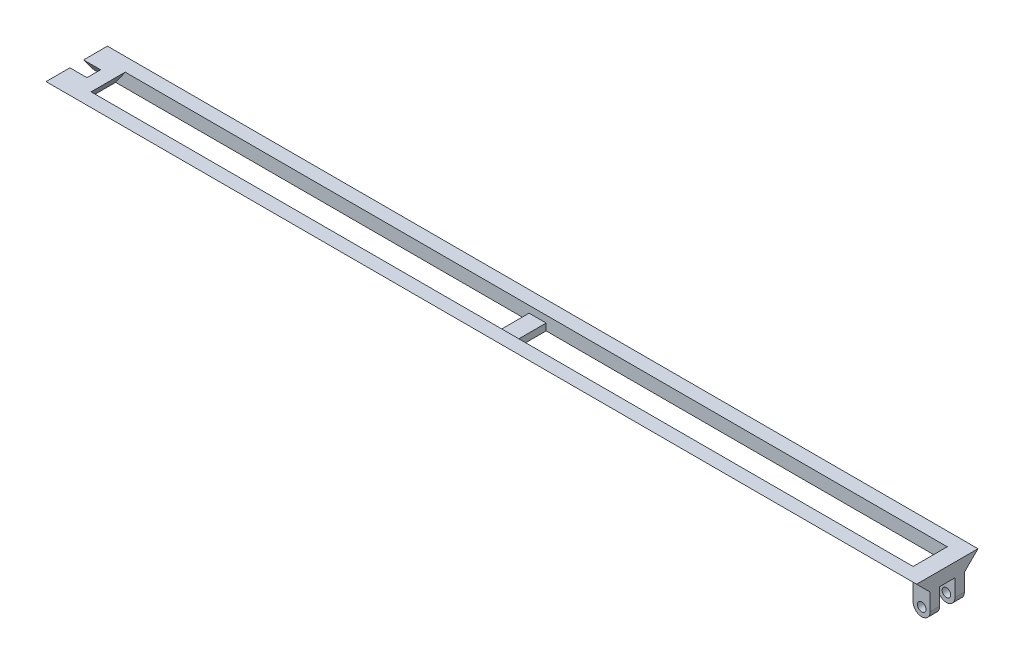
ISO-10303-21;
HEADER;
FILE_DESCRIPTION(('STEP AP214'),'2;1');
FILE_NAME('part.step','',(''),(''),'','','');
FILE_SCHEMA(('AUTOMOTIVE_DESIGN { 1 0 10303 214 1 1 1 1 }'));
ENDSEC;
DATA;
#1=APPLICATION_CONTEXT('core data for automotive mechanical design processes');
#2=APPLICATION_PROTOCOL_DEFINITION('international standard','automotive_design',2000,#1);
#3=PRODUCT_CONTEXT('',#1,'mechanical');
#4=PRODUCT('Part','Part','',(#3));
#5=PRODUCT_RELATED_PRODUCT_CATEGORY('part','',(#4));
#6=PRODUCT_DEFINITION_FORMATION('','',#4);
#7=PRODUCT_DEFINITION_CONTEXT('part definition',#1,'design');
#8=PRODUCT_DEFINITION('design','',#6,#7);
#9=PRODUCT_DEFINITION_SHAPE('','',#8);
#10=(LENGTH_UNIT() NAMED_UNIT(*) SI_UNIT(.MILLI.,.METRE.));
#11=(NAMED_UNIT(*) PLANE_ANGLE_UNIT() SI_UNIT($,.RADIAN.));
#12=(NAMED_UNIT(*) SI_UNIT($,.STERADIAN.) SOLID_ANGLE_UNIT());
#13=UNCERTAINTY_MEASURE_WITH_UNIT(LENGTH_MEASURE(1.E-05),#10,'distance_accuracy_value','');
#14=(GEOMETRIC_REPRESENTATION_CONTEXT(3) GLOBAL_UNCERTAINTY_ASSIGNED_CONTEXT((#13)) GLOBAL_UNIT_ASSIGNED_CONTEXT((#10,
#11,#12)) REPRESENTATION_CONTEXT('',''));
#15=CARTESIAN_POINT('',(0.,0.,0.));
#16=DIRECTION('',(0.,0.,1.));
#17=DIRECTION('',(1.,0.,0.));
#18=AXIS2_PLACEMENT_3D('',#15,#16,#17);
#19=CARTESIAN_POINT('',(158.75,5.08,-11.43));
#20=DIRECTION('',(-1.,0.,0.));
#21=DIRECTION('',(0.,0.,1.));
#22=AXIS2_PLACEMENT_3D('',#19,#20,#21);
#23=PLANE('',#22);
#24=DIRECTION('',(0.,1.,0.));
#25=VECTOR('',#24,1.);
#26=CARTESIAN_POINT('',(158.75,0.,-2.8575));
#27=LINE('',#26,#25);
#28=CARTESIAN_POINT('',(158.75,-6.35,-2.8575));
#29=VERTEX_POINT('',#28);
#30=CARTESIAN_POINT('',(158.75,0.,-2.8575));
#31=VERTEX_POINT('',#30);
#32=EDGE_CURVE('E200',#29,#31,#27,.T.);
#33=ORIENTED_EDGE('',*,*,#32,.F.);
#34=DIRECTION('',(0.,0.,-1.));
#35=VECTOR('',#34,1.);
#36=CARTESIAN_POINT('',(158.75,-6.35,6.35));
#37=LINE('',#36,#35);
#38=CARTESIAN_POINT('',(158.75,-6.35,-6.35));
#39=VERTEX_POINT('',#38);
#40=EDGE_CURVE('E236',#29,#39,#37,.T.);
#41=ORIENTED_EDGE('',*,*,#40,.T.);
#42=DIRECTION('',(0.,1.,0.));
#43=VECTOR('',#42,1.);
#44=CARTESIAN_POINT('',(158.75,0.,-6.35));
#45=LINE('',#44,#43);
#46=CARTESIAN_POINT('',(158.75,0.,-6.35));
#47=VERTEX_POINT('',#46);
#48=EDGE_CURVE('E231',#39,#47,#45,.T.);
#49=ORIENTED_EDGE('',*,*,#48,.T.);
#50=DIRECTION('',(0.,-0.707106781186548,0.707106781186548));
#51=VECTOR('',#50,1.);
#52=CARTESIAN_POINT('',(158.75,5.08,-11.43));
#53=LINE('',#52,#51);
#54=CARTESIAN_POINT('',(158.75,5.08,-11.43));
#55=VERTEX_POINT('',#54);
#56=EDGE_CURVE('E256',#55,#47,#53,.T.);
#57=ORIENTED_EDGE('',*,*,#56,.F.);
#58=DIRECTION('',(0.,0.,-1.));
#59=VECTOR('',#58,1.);
#60=CARTESIAN_POINT('',(158.75,5.08,-11.43));
#61=LINE('',#60,#59);
#62=CARTESIAN_POINT('',(158.75,5.08,11.43));
#63=VERTEX_POINT('',#62);
#64=EDGE_CURVE('E345',#63,#55,#61,.T.);
#65=ORIENTED_EDGE('',*,*,#64,.F.);
#66=DIRECTION('',(0.,0.707106781186548,0.707106781186548));
#67=VECTOR('',#66,1.);
#68=CARTESIAN_POINT('',(158.75,5.08,11.43));
#69=LINE('',#68,#67);
#70=CARTESIAN_POINT('',(158.75,0.,6.35));
#71=VERTEX_POINT('',#70);
#72=EDGE_CURVE('E254',#71,#63,#69,.T.);
#73=ORIENTED_EDGE('',*,*,#72,.F.);
#74=DIRECTION('',(0.,1.,0.));
#75=VECTOR('',#74,1.);
#76=CARTESIAN_POINT('',(158.75,0.,6.35));
#77=LINE('',#76,#75);
#78=CARTESIAN_POINT('',(158.75,-6.35,6.35));
#79=VERTEX_POINT('',#78);
#80=EDGE_CURVE('E233',#79,#71,#77,.T.);
#81=ORIENTED_EDGE('',*,*,#80,.F.);
#82=CARTESIAN_POINT('',(158.75,-6.35,2.8575));
#83=VERTEX_POINT('',#82);
#84=EDGE_CURVE('E243',#79,#83,#37,.T.);
#85=ORIENTED_EDGE('',*,*,#84,.T.);
#86=DIRECTION('',(0.,1.,0.));
#87=VECTOR('',#86,1.);
#88=CARTESIAN_POINT('',(158.75,0.,2.8575));
#89=LINE('',#88,#87);
#90=CARTESIAN_POINT('',(158.75,0.,2.8575));
#91=VERTEX_POINT('',#90);
#92=EDGE_CURVE('E60',#83,#91,#89,.T.);
#93=ORIENTED_EDGE('',*,*,#92,.T.);
#94=DIRECTION('',(0.,0.,1.));
#95=VECTOR('',#94,1.);
#96=CARTESIAN_POINT('',(158.75,0.,-2.8575));
#97=LINE('',#96,#95);
#98=EDGE_CURVE('E199',#31,#91,#97,.T.);
#99=ORIENTED_EDGE('',*,*,#98,.F.);
#100=EDGE_LOOP('',(#33,#41,#49,#57,#65,#73,#81,#85,#93,#99));
#101=FACE_BOUND('',#100,.T.);
#102=ADVANCED_FACE('F43',(#101),#23,.F.);
#103=CARTESIAN_POINT('',(152.4,5.08,6.35));
#104=DIRECTION('',(-1.,0.,0.));
#105=DIRECTION('',(0.,0.,1.));
#106=AXIS2_PLACEMENT_3D('',#103,#104,#105);
#107=PLANE('',#106);
#108=DIRECTION('',(0.,0.,-1.));
#109=VECTOR('',#108,1.);
#110=CARTESIAN_POINT('',(152.4,-6.35,6.35));
#111=LINE('',#110,#109);
#112=CARTESIAN_POINT('',(152.4,-6.35,-2.8575));
#113=VERTEX_POINT('',#112);
#114=CARTESIAN_POINT('',(152.4,-6.35,-6.35));
#115=VERTEX_POINT('',#114);
#116=EDGE_CURVE('E212',#113,#115,#111,.T.);
#117=ORIENTED_EDGE('',*,*,#116,.F.);
#118=DIRECTION('',(0.,-1.,0.));
#119=VECTOR('',#118,1.);
#120=CARTESIAN_POINT('',(152.4,0.,-2.8575));
#121=LINE('',#120,#119);
#122=CARTESIAN_POINT('',(152.4,0.,-2.8575));
#123=VERTEX_POINT('',#122);
#124=EDGE_CURVE('E204',#123,#113,#121,.T.);
#125=ORIENTED_EDGE('',*,*,#124,.F.);
#126=DIRECTION('',(0.,0.,1.));
#127=VECTOR('',#126,1.);
#128=CARTESIAN_POINT('',(152.4,0.,-2.8575));
#129=LINE('',#128,#127);
#130=CARTESIAN_POINT('',(152.4,0.,2.8575));
#131=VERTEX_POINT('',#130);
#132=EDGE_CURVE('E190',#123,#131,#129,.T.);
#133=ORIENTED_EDGE('',*,*,#132,.T.);
#134=DIRECTION('',(0.,-1.,0.));
#135=VECTOR('',#134,1.);
#136=CARTESIAN_POINT('',(152.4,0.,2.8575));
#137=LINE('',#136,#135);
#138=CARTESIAN_POINT('',(152.4,-6.35,2.8575));
#139=VERTEX_POINT('',#138);
#140=EDGE_CURVE('E220',#131,#139,#137,.T.);
#141=ORIENTED_EDGE('',*,*,#140,.T.);
#142=CARTESIAN_POINT('',(152.4,-6.35,6.35));
#143=VERTEX_POINT('',#142);
#144=EDGE_CURVE('E246',#143,#139,#111,.T.);
#145=ORIENTED_EDGE('',*,*,#144,.F.);
#146=DIRECTION('',(0.,-1.,0.));
#147=VECTOR('',#146,1.);
#148=CARTESIAN_POINT('',(152.4,0.,6.35));
#149=LINE('',#148,#147);
#150=CARTESIAN_POINT('',(152.4,0.,6.35));
#151=VERTEX_POINT('',#150);
#152=EDGE_CURVE('E228',#151,#143,#149,.T.);
#153=ORIENTED_EDGE('',*,*,#152,.F.);
#154=DIRECTION('',(0.,-1.,0.));
#155=VECTOR('',#154,1.);
#156=CARTESIAN_POINT('',(152.4,5.08,6.35));
#157=LINE('',#156,#155);
#158=CARTESIAN_POINT('',(152.4,5.08,6.35));
#159=VERTEX_POINT('',#158);
#160=EDGE_CURVE('E328',#159,#151,#157,.T.);
#161=ORIENTED_EDGE('',*,*,#160,.F.);
#162=DIRECTION('',(0.,0.,-1.));
#163=VECTOR('',#162,1.);
#164=CARTESIAN_POINT('',(152.4,5.08,6.35));
#165=LINE('',#164,#163);
#166=CARTESIAN_POINT('',(152.4,5.08,-6.35));
#167=VERTEX_POINT('',#166);
#168=EDGE_CURVE('E322',#159,#167,#165,.T.);
#169=ORIENTED_EDGE('',*,*,#168,.T.);
#170=DIRECTION('',(0.,-1.,0.));
#171=VECTOR('',#170,1.);
#172=CARTESIAN_POINT('',(152.4,5.08,-6.35));
#173=LINE('',#172,#171);
#174=CARTESIAN_POINT('',(152.4,0.,-6.35));
#175=VERTEX_POINT('',#174);
#176=EDGE_CURVE('E335',#167,#175,#173,.T.);
#177=ORIENTED_EDGE('',*,*,#176,.T.);
#178=DIRECTION('',(0.,-1.,0.));
#179=VECTOR('',#178,1.);
#180=CARTESIAN_POINT('',(152.4,0.,-6.35));
#181=LINE('',#180,#179);
#182=EDGE_CURVE('E226',#175,#115,#181,.T.);
#183=ORIENTED_EDGE('',*,*,#182,.T.);
#184=EDGE_LOOP('',(#117,#125,#133,#141,#145,#153,#161,#169,#177,#183));
#185=FACE_BOUND('',#184,.T.);
#186=ADVANCED_FACE('F210',(#185),#107,.T.);
#187=CARTESIAN_POINT('',(155.575,-6.35,6.35));
#188=DIRECTION('',(0.,0.,-1.));
#189=DIRECTION('',(-1.,0.,0.));
#190=AXIS2_PLACEMENT_3D('',#187,#188,#189);
#191=CYLINDRICAL_SURFACE('',#190,3.17499999999998);
#192=CARTESIAN_POINT('',(155.575,-6.35,-2.8575));
#193=DIRECTION('',(0.,0.,1.));
#194=DIRECTION('',(1.,0.,0.));
#195=AXIS2_PLACEMENT_3D('',#192,#193,#194);
#196=CIRCLE('',#195,3.17499999999998);
#197=EDGE_CURVE('E213',#113,#29,#196,.T.);
#198=ORIENTED_EDGE('',*,*,#197,.F.);
#199=ORIENTED_EDGE('',*,*,#116,.T.);
#200=CARTESIAN_POINT('',(155.575,-6.35,-6.35));
#201=DIRECTION('',(0.,0.,1.));
#202=DIRECTION('',(1.,0.,0.));
#203=AXIS2_PLACEMENT_3D('',#200,#201,#202);
#204=CIRCLE('',#203,3.17499999999998);
#205=EDGE_CURVE('E238',#115,#39,#204,.T.);
#206=ORIENTED_EDGE('',*,*,#205,.T.);
#207=ORIENTED_EDGE('',*,*,#40,.F.);
#208=EDGE_LOOP('',(#198,#199,#206,#207));
#209=FACE_BOUND('',#208,.T.);
#210=ADVANCED_FACE('F423',(#209),#191,.T.);
#211=CARTESIAN_POINT('',(0.,0.,0.));
#212=DIRECTION('',(0.,1.,0.));
#213=DIRECTION('',(0.,0.,1.));
#214=AXIS2_PLACEMENT_3D('',#211,#212,#213);
#215=PLANE('',#214);
#216=DIRECTION('',(0.,0.,-1.));
#217=VECTOR('',#216,1.);
#218=CARTESIAN_POINT('',(3.175,0.,-6.35000000000003));
#219=LINE('',#218,#217);
#220=CARTESIAN_POINT('',(3.17499999999998,0.,6.35));
#221=VERTEX_POINT('',#220);
#222=CARTESIAN_POINT('',(3.17500000000001,0.,-6.35));
#223=VERTEX_POINT('',#222);
#224=EDGE_CURVE('E278',#221,#223,#219,.T.);
#225=ORIENTED_EDGE('',*,*,#224,.F.);
#226=DIRECTION('',(1.,0.,0.));
#227=VECTOR('',#226,1.);
#228=CARTESIAN_POINT('',(-165.1,0.,6.35));
#229=LINE('',#228,#227);
#230=CARTESIAN_POINT('',(-3.17500000000004,0.,6.35));
#231=VERTEX_POINT('',#230);
#232=EDGE_CURVE('E258',#231,#221,#229,.T.);
#233=ORIENTED_EDGE('',*,*,#232,.F.);
#234=DIRECTION('',(0.,0.,1.));
#235=VECTOR('',#234,1.);
#236=CARTESIAN_POINT('',(-3.175,0.,-6.35000000000003));
#237=LINE('',#236,#235);
#238=CARTESIAN_POINT('',(-3.17500000000007,0.,-6.35));
#239=VERTEX_POINT('',#238);
#240=EDGE_CURVE('E271',#239,#231,#237,.T.);
#241=ORIENTED_EDGE('',*,*,#240,.F.);
#242=DIRECTION('',(1.,0.,0.));
#243=VECTOR('',#242,1.);
#244=CARTESIAN_POINT('',(-165.1,0.,-6.35));
#245=LINE('',#244,#243);
#246=EDGE_CURVE('E262',#239,#223,#245,.T.);
#247=ORIENTED_EDGE('',*,*,#246,.T.);
#248=EDGE_LOOP('',(#225,#233,#241,#247));
#249=FACE_BOUND('',#248,.T.);
#250=ADVANCED_FACE('F382',(#249),#215,.F.);
#251=CARTESIAN_POINT('',(-152.4,5.08,-6.35));
#252=DIRECTION('',(0.,0.,1.));
#253=DIRECTION('',(1.,0.,0.));
#254=AXIS2_PLACEMENT_3D('',#251,#252,#253);
#255=PLANE('',#254);
#256=DIRECTION('',(-1.,0.,0.));
#257=VECTOR('',#256,1.);
#258=CARTESIAN_POINT('',(3.175,2.54,-6.35000000000003));
#259=LINE('',#258,#257);
#260=CARTESIAN_POINT('',(3.175,2.54,-6.35000000000003));
#261=VERTEX_POINT('',#260);
#262=CARTESIAN_POINT('',(-3.175,2.54,-6.35000000000003));
#263=VERTEX_POINT('',#262);
#264=EDGE_CURVE('E270',#261,#263,#259,.T.);
#265=ORIENTED_EDGE('',*,*,#264,.F.);
#266=DIRECTION('',(0.,-1.,0.));
#267=VECTOR('',#266,1.);
#268=CARTESIAN_POINT('',(3.175,2.54,-6.35000000000003));
#269=LINE('',#268,#267);
#270=EDGE_CURVE('E291',#261,#223,#269,.T.);
#271=ORIENTED_EDGE('',*,*,#270,.T.);
#272=DIRECTION('',(-1.,0.,0.));
#273=VECTOR('',#272,1.);
#274=CARTESIAN_POINT('',(-152.4,0.,-6.35));
#275=LINE('',#274,#273);
#276=EDGE_CURVE('E329',#175,#223,#275,.T.);
#277=ORIENTED_EDGE('',*,*,#276,.F.);
#278=ORIENTED_EDGE('',*,*,#176,.F.);
#279=DIRECTION('',(-1.,0.,0.));
#280=VECTOR('',#279,1.);
#281=CARTESIAN_POINT('',(-152.4,5.08,-6.35));
#282=LINE('',#281,#280);
#283=CARTESIAN_POINT('',(-153.414418528865,5.08,-6.35));
#284=VERTEX_POINT('',#283);
#285=EDGE_CURVE('E67',#167,#284,#282,.T.);
#286=ORIENTED_EDGE('',*,*,#285,.T.);
#287=DIRECTION('',(-0.57357643635105,-0.819152044288989,0.));
#288=VECTOR('',#287,1.);
#289=CARTESIAN_POINT('',(-156.97147282297,0.,-6.35));
#290=LINE('',#289,#288);
#291=CARTESIAN_POINT('',(-156.97147282297,0.,-6.35));
#292=VERTEX_POINT('',#291);
#293=EDGE_CURVE('E11',#284,#292,#290,.T.);
#294=ORIENTED_EDGE('',*,*,#293,.T.);
#295=EDGE_CURVE('E314',#239,#292,#275,.T.);
#296=ORIENTED_EDGE('',*,*,#295,.F.);
#297=DIRECTION('',(0.,-1.,0.));
#298=VECTOR('',#297,1.);
#299=CARTESIAN_POINT('',(-3.175,2.54,-6.35000000000003));
#300=LINE('',#299,#298);
#301=EDGE_CURVE('E288',#263,#239,#300,.T.);
#302=ORIENTED_EDGE('',*,*,#301,.F.);
#303=EDGE_LOOP('',(#265,#271,#277,#278,#286,#294,#296,#302));
#304=FACE_BOUND('',#303,.T.);
#305=ADVANCED_FACE('F374',(#304),#255,.T.);
#306=CARTESIAN_POINT('',(-152.4,5.08,6.35));
#307=DIRECTION('',(0.,0.,-1.));
#308=DIRECTION('',(-1.,0.,0.));
#309=AXIS2_PLACEMENT_3D('',#306,#307,#308);
#310=PLANE('',#309);
#311=DIRECTION('',(1.,0.,0.));
#312=VECTOR('',#311,1.);
#313=CARTESIAN_POINT('',(-152.4,0.,6.35));
#314=LINE('',#313,#312);
#315=EDGE_CURVE('E331',#221,#151,#314,.T.);
#316=ORIENTED_EDGE('',*,*,#315,.F.);
#317=DIRECTION('',(0.,-1.,0.));
#318=VECTOR('',#317,1.);
#319=CARTESIAN_POINT('',(3.17500000000002,2.54,6.35));
#320=LINE('',#319,#318);
#321=CARTESIAN_POINT('',(3.17500000000002,2.54,6.35));
#322=VERTEX_POINT('',#321);
#323=EDGE_CURVE('E277',#322,#221,#320,.T.);
#324=ORIENTED_EDGE('',*,*,#323,.F.);
#325=DIRECTION('',(1.,0.,0.));
#326=VECTOR('',#325,1.);
#327=CARTESIAN_POINT('',(3.17500000000002,2.54,6.35));
#328=LINE('',#327,#326);
#329=CARTESIAN_POINT('',(-3.17500000000001,2.54,6.35));
#330=VERTEX_POINT('',#329);
#331=EDGE_CURVE('E275',#330,#322,#328,.T.);
#332=ORIENTED_EDGE('',*,*,#331,.F.);
#333=DIRECTION('',(0.,-1.,0.));
#334=VECTOR('',#333,1.);
#335=CARTESIAN_POINT('',(-3.17500000000001,2.54,6.35));
#336=LINE('',#335,#334);
#337=EDGE_CURVE('E285',#330,#231,#336,.T.);
#338=ORIENTED_EDGE('',*,*,#337,.T.);
#339=CARTESIAN_POINT('',(-156.97147282297,0.,6.35));
#340=VERTEX_POINT('',#339);
#341=EDGE_CURVE('E324',#340,#231,#314,.T.);
#342=ORIENTED_EDGE('',*,*,#341,.F.);
#343=DIRECTION('',(0.57357643635105,0.819152044288989,0.));
#344=VECTOR('',#343,1.);
#345=CARTESIAN_POINT('',(-156.97147282297,0.,6.35));
#346=LINE('',#345,#344);
#347=CARTESIAN_POINT('',(-153.414418528865,5.08,6.35));
#348=VERTEX_POINT('',#347);
#349=EDGE_CURVE('E53',#340,#348,#346,.T.);
#350=ORIENTED_EDGE('',*,*,#349,.T.);
#351=DIRECTION('',(1.,0.,0.));
#352=VECTOR('',#351,1.);
#353=CARTESIAN_POINT('',(-152.4,5.08,6.35));
#354=LINE('',#353,#352);
#355=EDGE_CURVE('E326',#348,#159,#354,.T.);
#356=ORIENTED_EDGE('',*,*,#355,.T.);
#357=ORIENTED_EDGE('',*,*,#160,.T.);
#358=EDGE_LOOP('',(#316,#324,#332,#338,#342,#350,#356,#357));
#359=FACE_BOUND('',#358,.T.);
#360=ADVANCED_FACE('F361',(#359),#310,.T.);
#361=CARTESIAN_POINT('',(-165.1,5.08,-11.43));
#362=DIRECTION('',(1.,0.,0.));
#363=DIRECTION('',(0.,0.,-1.));
#364=AXIS2_PLACEMENT_3D('',#361,#362,#363);
#365=PLANE('',#364);
#366=DIRECTION('',(0.,0.,1.));
#367=VECTOR('',#366,1.);
#368=CARTESIAN_POINT('',(-165.1,5.08,-11.43));
#369=LINE('',#368,#367);
#370=CARTESIAN_POINT('',(-165.1,5.08,-11.43));
#371=VERTEX_POINT('',#370);
#372=CARTESIAN_POINT('',(-165.1,5.08,-2.54));
#373=VERTEX_POINT('',#372);
#374=EDGE_CURVE('E339',#371,#373,#369,.T.);
#375=ORIENTED_EDGE('',*,*,#374,.F.);
#376=DIRECTION('',(0.,-0.707106781186548,0.707106781186548));
#377=VECTOR('',#376,1.);
#378=CARTESIAN_POINT('',(-165.1,5.08,-11.43));
#379=LINE('',#378,#377);
#380=CARTESIAN_POINT('',(-165.1,0.,-6.35));
#381=VERTEX_POINT('',#380);
#382=EDGE_CURVE('E265',#371,#381,#379,.T.);
#383=ORIENTED_EDGE('',*,*,#382,.T.);
#384=DIRECTION('',(0.,-0.8,-0.6));
#385=VECTOR('',#384,1.);
#386=CARTESIAN_POINT('',(-165.1,5.08,-2.54));
#387=LINE('',#386,#385);
#388=EDGE_CURVE('E294',#373,#381,#387,.T.);
#389=ORIENTED_EDGE('',*,*,#388,.F.);
#390=EDGE_LOOP('',(#375,#383,#389));
#391=FACE_BOUND('',#390,.T.);
#392=ADVANCED_FACE('F413',(#391),#365,.F.);
#393=CARTESIAN_POINT('',(0.,5.08,0.));
#394=DIRECTION('',(0.,1.,0.));
#395=DIRECTION('',(0.,0.,1.));
#396=AXIS2_PLACEMENT_3D('',#393,#394,#395);
#397=PLANE('',#396);
#398=ORIENTED_EDGE('',*,*,#355,.F.);
#399=DIRECTION('',(0.,0.,-1.));
#400=VECTOR('',#399,1.);
#401=CARTESIAN_POINT('',(-153.414418528865,5.08,0.));
#402=LINE('',#401,#400);
#403=EDGE_CURVE('E354',#348,#284,#402,.T.);
#404=ORIENTED_EDGE('',*,*,#403,.T.);
#405=ORIENTED_EDGE('',*,*,#285,.F.);
#406=ORIENTED_EDGE('',*,*,#168,.F.);
#407=EDGE_LOOP('',(#398,#404,#405,#406));
#408=FACE_BOUND('',#407,.T.);
#409=DIRECTION('',(-1.,0.,0.));
#410=VECTOR('',#409,1.);
#411=CARTESIAN_POINT('',(-158.75,5.08,-2.54));
#412=LINE('',#411,#410);
#413=CARTESIAN_POINT('',(-158.75,5.08,-2.54));
#414=VERTEX_POINT('',#413);
#415=EDGE_CURVE('E312',#414,#373,#412,.T.);
#416=ORIENTED_EDGE('',*,*,#415,.F.);
#417=DIRECTION('',(0.,0.,-1.));
#418=VECTOR('',#417,1.);
#419=CARTESIAN_POINT('',(-158.75,5.08,-2.54));
#420=LINE('',#419,#418);
#421=CARTESIAN_POINT('',(-158.75,5.08,2.54));
#422=VERTEX_POINT('',#421);
#423=EDGE_CURVE('E305',#422,#414,#420,.T.);
#424=ORIENTED_EDGE('',*,*,#423,.F.);
#425=DIRECTION('',(-1.,0.,0.));
#426=VECTOR('',#425,1.);
#427=CARTESIAN_POINT('',(-158.75,5.08,2.54));
#428=LINE('',#427,#426);
#429=CARTESIAN_POINT('',(-165.1,5.08,2.54));
#430=VERTEX_POINT('',#429);
#431=EDGE_CURVE('E315',#422,#430,#428,.T.);
#432=ORIENTED_EDGE('',*,*,#431,.T.);
#433=CARTESIAN_POINT('',(-165.1,5.08,11.43));
#434=VERTEX_POINT('',#433);
#435=EDGE_CURVE('E338',#430,#434,#369,.T.);
#436=ORIENTED_EDGE('',*,*,#435,.T.);
#437=DIRECTION('',(1.,0.,0.));
#438=VECTOR('',#437,1.);
#439=CARTESIAN_POINT('',(-165.1,5.08,11.43));
#440=LINE('',#439,#438);
#441=EDGE_CURVE('E342',#434,#63,#440,.T.);
#442=ORIENTED_EDGE('',*,*,#441,.T.);
#443=ORIENTED_EDGE('',*,*,#64,.T.);
#444=DIRECTION('',(-1.,0.,0.));
#445=VECTOR('',#444,1.);
#446=CARTESIAN_POINT('',(-165.1,5.08,-11.43));
#447=LINE('',#446,#445);
#448=EDGE_CURVE('E348',#55,#371,#447,.T.);
#449=ORIENTED_EDGE('',*,*,#448,.T.);
#450=ORIENTED_EDGE('',*,*,#374,.T.);
#451=EDGE_LOOP('',(#416,#424,#432,#436,#442,#443,#449,#450));
#452=FACE_BOUND('',#451,.T.);
#453=ADVANCED_FACE('F367',(#408,#452),#397,.T.);
#454=CARTESIAN_POINT('',(-158.75,0.,-6.35));
#455=VERTEX_POINT('',#454);
#456=EDGE_CURVE('E263',#455,#292,#245,.T.);
#457=ORIENTED_EDGE('',*,*,#456,.T.);
#458=DIRECTION('',(0.,0.,1.));
#459=VECTOR('',#458,1.);
#460=CARTESIAN_POINT('',(-156.97147282297,0.,6.35));
#461=LINE('',#460,#459);
#462=EDGE_CURVE('E351',#292,#340,#461,.T.);
#463=ORIENTED_EDGE('',*,*,#462,.T.);
#464=CARTESIAN_POINT('',(-158.75,0.,6.35));
#465=VERTEX_POINT('',#464);
#466=EDGE_CURVE('E259',#465,#340,#229,.T.);
#467=ORIENTED_EDGE('',*,*,#466,.F.);
#468=DIRECTION('',(0.,0.,1.));
#469=VECTOR('',#468,1.);
#470=CARTESIAN_POINT('',(-158.75,0.,-6.35));
#471=LINE('',#470,#469);
#472=EDGE_CURVE('E298',#455,#465,#471,.T.);
#473=ORIENTED_EDGE('',*,*,#472,.F.);
#474=EDGE_LOOP('',(#457,#463,#467,#473));
#475=FACE_BOUND('',#474,.T.);
#476=ADVANCED_FACE('F399',(#475),#215,.F.);
#477=DIRECTION('',(0.,0.8,-0.6));
#478=VECTOR('',#477,1.);
#479=CARTESIAN_POINT('',(-165.1,0.,6.35));
#480=LINE('',#479,#478);
#481=CARTESIAN_POINT('',(-165.1,0.,6.35));
#482=VERTEX_POINT('',#481);
#483=EDGE_CURVE('E299',#482,#430,#480,.T.);
#484=ORIENTED_EDGE('',*,*,#483,.F.);
#485=DIRECTION('',(0.,0.707106781186548,0.707106781186548));
#486=VECTOR('',#485,1.);
#487=CARTESIAN_POINT('',(-165.1,5.08,11.43));
#488=LINE('',#487,#486);
#489=EDGE_CURVE('E250',#482,#434,#488,.T.);
#490=ORIENTED_EDGE('',*,*,#489,.T.);
#491=ORIENTED_EDGE('',*,*,#435,.F.);
#492=EDGE_LOOP('',(#484,#490,#491));
#493=FACE_BOUND('',#492,.T.);
#494=ADVANCED_FACE('F436',(#493),#365,.F.);
#495=CARTESIAN_POINT('',(-158.75,5.08,-2.54));
#496=DIRECTION('',(0.,0.6,-0.8));
#497=DIRECTION('',(0.,0.8,0.6));
#498=AXIS2_PLACEMENT_3D('',#495,#496,#497);
#499=PLANE('',#498);
#500=ORIENTED_EDGE('',*,*,#388,.T.);
#501=DIRECTION('',(-1.,0.,0.));
#502=VECTOR('',#501,1.);
#503=CARTESIAN_POINT('',(-158.75,0.,-6.35));
#504=LINE('',#503,#502);
#505=EDGE_CURVE('E308',#455,#381,#504,.T.);
#506=ORIENTED_EDGE('',*,*,#505,.F.);
#507=DIRECTION('',(0.,-0.8,-0.6));
#508=VECTOR('',#507,1.);
#509=CARTESIAN_POINT('',(-158.75,5.08,-2.54));
#510=LINE('',#509,#508);
#511=EDGE_CURVE('E295',#414,#455,#510,.T.);
#512=ORIENTED_EDGE('',*,*,#511,.F.);
#513=ORIENTED_EDGE('',*,*,#415,.T.);
#514=EDGE_LOOP('',(#500,#506,#512,#513));
#515=FACE_BOUND('',#514,.T.);
#516=ADVANCED_FACE('F409',(#515),#499,.F.);
#517=CARTESIAN_POINT('',(-158.75,0.,6.35));
#518=DIRECTION('',(0.,0.6,0.8));
#519=DIRECTION('',(0.,-0.8,0.6));
#520=AXIS2_PLACEMENT_3D('',#517,#518,#519);
#521=PLANE('',#520);
#522=ORIENTED_EDGE('',*,*,#483,.T.);
#523=ORIENTED_EDGE('',*,*,#431,.F.);
#524=DIRECTION('',(0.,0.8,-0.6));
#525=VECTOR('',#524,1.);
#526=CARTESIAN_POINT('',(-158.75,0.,6.35));
#527=LINE('',#526,#525);
#528=EDGE_CURVE('E302',#465,#422,#527,.T.);
#529=ORIENTED_EDGE('',*,*,#528,.F.);
#530=DIRECTION('',(-1.,0.,0.));
#531=VECTOR('',#530,1.);
#532=CARTESIAN_POINT('',(-158.75,0.,6.35));
#533=LINE('',#532,#531);
#534=EDGE_CURVE('E318',#465,#482,#533,.T.);
#535=ORIENTED_EDGE('',*,*,#534,.T.);
#536=EDGE_LOOP('',(#522,#523,#529,#535));
#537=FACE_BOUND('',#536,.T.);
#538=ADVANCED_FACE('F401',(#537),#521,.F.);
#539=CARTESIAN_POINT('',(-158.75,0.,0.));
#540=DIRECTION('',(1.,0.,0.));
#541=DIRECTION('',(0.,0.,-1.));
#542=AXIS2_PLACEMENT_3D('',#539,#540,#541);
#543=PLANE('',#542);
#544=ORIENTED_EDGE('',*,*,#511,.T.);
#545=ORIENTED_EDGE('',*,*,#472,.T.);
#546=ORIENTED_EDGE('',*,*,#528,.T.);
#547=ORIENTED_EDGE('',*,*,#423,.T.);
#548=EDGE_LOOP('',(#544,#545,#546,#547));
#549=FACE_BOUND('',#548,.T.);
#550=ADVANCED_FACE('F405',(#549),#543,.F.);
#551=CARTESIAN_POINT('',(3.175,2.54,-6.35000000000003));
#552=DIRECTION('',(-1.,0.,0.));
#553=DIRECTION('',(0.,0.,1.));
#554=AXIS2_PLACEMENT_3D('',#551,#552,#553);
#555=PLANE('',#554);
#556=ORIENTED_EDGE('',*,*,#224,.T.);
#557=ORIENTED_EDGE('',*,*,#270,.F.);
#558=DIRECTION('',(0.,0.,-1.));
#559=VECTOR('',#558,1.);
#560=CARTESIAN_POINT('',(3.175,2.54,-6.35000000000003));
#561=LINE('',#560,#559);
#562=EDGE_CURVE('E268',#322,#261,#561,.T.);
#563=ORIENTED_EDGE('',*,*,#562,.F.);
#564=ORIENTED_EDGE('',*,*,#323,.T.);
#565=EDGE_LOOP('',(#556,#557,#563,#564));
#566=FACE_BOUND('',#565,.T.);
#567=ADVANCED_FACE('F385',(#566),#555,.F.);
#568=CARTESIAN_POINT('',(-3.175,2.54,-6.35000000000003));
#569=DIRECTION('',(1.,0.,0.));
#570=DIRECTION('',(0.,0.,-1.));
#571=AXIS2_PLACEMENT_3D('',#568,#569,#570);
#572=PLANE('',#571);
#573=ORIENTED_EDGE('',*,*,#240,.T.);
#574=ORIENTED_EDGE('',*,*,#337,.F.);
#575=DIRECTION('',(0.,0.,1.));
#576=VECTOR('',#575,1.);
#577=CARTESIAN_POINT('',(-3.175,2.54,-6.35000000000003));
#578=LINE('',#577,#576);
#579=EDGE_CURVE('E273',#263,#330,#578,.T.);
#580=ORIENTED_EDGE('',*,*,#579,.F.);
#581=ORIENTED_EDGE('',*,*,#301,.T.);
#582=EDGE_LOOP('',(#573,#574,#580,#581));
#583=FACE_BOUND('',#582,.T.);
#584=ADVANCED_FACE('F465',(#583),#572,.F.);
#585=CARTESIAN_POINT('',(0.,2.54,0.));
#586=DIRECTION('',(0.,-1.,0.));
#587=DIRECTION('',(0.,0.,-1.));
#588=AXIS2_PLACEMENT_3D('',#585,#586,#587);
#589=PLANE('',#588);
#590=ORIENTED_EDGE('',*,*,#562,.T.);
#591=ORIENTED_EDGE('',*,*,#264,.T.);
#592=ORIENTED_EDGE('',*,*,#579,.T.);
#593=ORIENTED_EDGE('',*,*,#331,.T.);
#594=EDGE_LOOP('',(#590,#591,#592,#593));
#595=FACE_BOUND('',#594,.T.);
#596=ADVANCED_FACE('F468',(#595),#589,.F.);
#597=CARTESIAN_POINT('',(-165.1,5.08,11.43));
#598=DIRECTION('',(0.,0.707106781186547,-0.707106781186547));
#599=DIRECTION('',(0.,0.707106781186548,0.707106781186548));
#600=AXIS2_PLACEMENT_3D('',#597,#598,#599);
#601=PLANE('',#600);
#602=ORIENTED_EDGE('',*,*,#72,.T.);
#603=ORIENTED_EDGE('',*,*,#441,.F.);
#604=ORIENTED_EDGE('',*,*,#489,.F.);
#605=ORIENTED_EDGE('',*,*,#534,.F.);
#606=ORIENTED_EDGE('',*,*,#466,.T.);
#607=ORIENTED_EDGE('',*,*,#341,.T.);
#608=ORIENTED_EDGE('',*,*,#232,.T.);
#609=ORIENTED_EDGE('',*,*,#315,.T.);
#610=EDGE_CURVE('E253',#151,#71,#229,.T.);
#611=ORIENTED_EDGE('',*,*,#610,.T.);
#612=EDGE_LOOP('',(#602,#603,#604,#605,#606,#607,#608,#609,#611));
#613=FACE_BOUND('',#612,.T.);
#614=ADVANCED_FACE('F390',(#613),#601,.F.);
#615=CARTESIAN_POINT('',(-165.1,5.08,-11.43));
#616=DIRECTION('',(0.,0.707106781186547,0.707106781186547));
#617=DIRECTION('',(0.,-0.707106781186548,0.707106781186548));
#618=AXIS2_PLACEMENT_3D('',#615,#616,#617);
#619=PLANE('',#618);
#620=ORIENTED_EDGE('',*,*,#56,.T.);
#621=EDGE_CURVE('E249',#175,#47,#245,.T.);
#622=ORIENTED_EDGE('',*,*,#621,.F.);
#623=ORIENTED_EDGE('',*,*,#276,.T.);
#624=ORIENTED_EDGE('',*,*,#246,.F.);
#625=ORIENTED_EDGE('',*,*,#295,.T.);
#626=ORIENTED_EDGE('',*,*,#456,.F.);
#627=ORIENTED_EDGE('',*,*,#505,.T.);
#628=ORIENTED_EDGE('',*,*,#382,.F.);
#629=ORIENTED_EDGE('',*,*,#448,.F.);
#630=EDGE_LOOP('',(#620,#622,#623,#624,#625,#626,#627,#628,#629));
#631=FACE_BOUND('',#630,.T.);
#632=ADVANCED_FACE('F378',(#631),#619,.F.);
#633=CARTESIAN_POINT('',(-156.97147282297,0.,0.));
#634=DIRECTION('',(0.819152044288989,-0.57357643635105,0.));
#635=DIRECTION('',(0.,0.,-1.));
#636=AXIS2_PLACEMENT_3D('',#633,#634,#635);
#637=PLANE('',#636);
#638=ORIENTED_EDGE('',*,*,#293,.F.);
#639=ORIENTED_EDGE('',*,*,#403,.F.);
#640=ORIENTED_EDGE('',*,*,#349,.F.);
#641=ORIENTED_EDGE('',*,*,#462,.F.);
#642=EDGE_LOOP('',(#638,#639,#640,#641));
#643=FACE_BOUND('',#642,.T.);
#644=ADVANCED_FACE('F46',(#643),#637,.T.);
#645=ORIENTED_EDGE('',*,*,#144,.T.);
#646=CARTESIAN_POINT('',(155.575,-6.35,2.8575));
#647=DIRECTION('',(0.,0.,1.));
#648=DIRECTION('',(1.,0.,0.));
#649=AXIS2_PLACEMENT_3D('',#646,#647,#648);
#650=CIRCLE('',#649,3.17499999999998);
#651=EDGE_CURVE('E223',#139,#83,#650,.T.);
#652=ORIENTED_EDGE('',*,*,#651,.T.);
#653=ORIENTED_EDGE('',*,*,#84,.F.);
#654=CARTESIAN_POINT('',(155.575,-6.35,6.35));
#655=DIRECTION('',(0.,0.,1.));
#656=DIRECTION('',(1.,0.,0.));
#657=AXIS2_PLACEMENT_3D('',#654,#655,#656);
#658=CIRCLE('',#657,3.17499999999998);
#659=EDGE_CURVE('E230',#143,#79,#658,.T.);
#660=ORIENTED_EDGE('',*,*,#659,.F.);
#661=EDGE_LOOP('',(#645,#652,#653,#660));
#662=FACE_BOUND('',#661,.T.);
#663=ADVANCED_FACE('F428',(#662),#191,.T.);
#664=CARTESIAN_POINT('',(155.575,-6.35,6.35));
#665=DIRECTION('',(0.,0.,1.));
#666=DIRECTION('',(1.,0.,0.));
#667=AXIS2_PLACEMENT_3D('',#664,#665,#666);
#668=PLANE('',#667);
#669=CARTESIAN_POINT('',(155.575,-6.35,6.35));
#670=DIRECTION('',(0.,0.,1.));
#671=DIRECTION('',(1.,0.,0.));
#672=AXIS2_PLACEMENT_3D('',#669,#670,#671);
#673=CIRCLE('',#672,1.59999999999999);
#674=CARTESIAN_POINT('',(157.175,-6.35,6.35));
#675=VERTEX_POINT('',#674);
#676=EDGE_CURVE('E503',#675,#675,#673,.T.);
#677=ORIENTED_EDGE('',*,*,#676,.F.);
#678=EDGE_LOOP('',(#677));
#679=FACE_BOUND('',#678,.T.);
#680=ORIENTED_EDGE('',*,*,#610,.F.);
#681=ORIENTED_EDGE('',*,*,#152,.T.);
#682=ORIENTED_EDGE('',*,*,#659,.T.);
#683=ORIENTED_EDGE('',*,*,#80,.T.);
#684=EDGE_LOOP('',(#680,#681,#682,#683));
#685=FACE_BOUND('',#684,.T.);
#686=ADVANCED_FACE('F432',(#679,#685),#668,.T.);
#687=CARTESIAN_POINT('',(155.575,-6.35,-6.35));
#688=DIRECTION('',(0.,0.,1.));
#689=DIRECTION('',(1.,0.,0.));
#690=AXIS2_PLACEMENT_3D('',#687,#688,#689);
#691=PLANE('',#690);
#692=CARTESIAN_POINT('',(155.575,-6.35,-6.35));
#693=DIRECTION('',(0.,0.,1.));
#694=DIRECTION('',(1.,0.,0.));
#695=AXIS2_PLACEMENT_3D('',#692,#693,#694);
#696=CIRCLE('',#695,1.59999999999999);
#697=CARTESIAN_POINT('',(157.175,-6.35,-6.35));
#698=VERTEX_POINT('',#697);
#699=EDGE_CURVE('E506',#698,#698,#696,.T.);
#700=ORIENTED_EDGE('',*,*,#699,.T.);
#701=EDGE_LOOP('',(#700));
#702=FACE_BOUND('',#701,.T.);
#703=ORIENTED_EDGE('',*,*,#621,.T.);
#704=ORIENTED_EDGE('',*,*,#48,.F.);
#705=ORIENTED_EDGE('',*,*,#205,.F.);
#706=ORIENTED_EDGE('',*,*,#182,.F.);
#707=EDGE_LOOP('',(#703,#704,#705,#706));
#708=FACE_BOUND('',#707,.T.);
#709=ADVANCED_FACE('F421',(#702,#708),#691,.F.);
#710=CARTESIAN_POINT('',(158.75,0.,-2.8575));
#711=DIRECTION('',(0.,1.,0.));
#712=DIRECTION('',(0.,0.,1.));
#713=AXIS2_PLACEMENT_3D('',#710,#711,#712);
#714=PLANE('',#713);
#715=DIRECTION('',(-1.,0.,0.));
#716=VECTOR('',#715,1.);
#717=CARTESIAN_POINT('',(158.75,0.,2.8575));
#718=LINE('',#717,#716);
#719=EDGE_CURVE('E195',#91,#131,#718,.T.);
#720=ORIENTED_EDGE('',*,*,#719,.T.);
#721=ORIENTED_EDGE('',*,*,#132,.F.);
#722=DIRECTION('',(-1.,0.,0.));
#723=VECTOR('',#722,1.);
#724=CARTESIAN_POINT('',(158.75,0.,-2.8575));
#725=LINE('',#724,#723);
#726=EDGE_CURVE('E193',#31,#123,#725,.T.);
#727=ORIENTED_EDGE('',*,*,#726,.F.);
#728=ORIENTED_EDGE('',*,*,#98,.T.);
#729=EDGE_LOOP('',(#720,#721,#727,#728));
#730=FACE_BOUND('',#729,.T.);
#731=ADVANCED_FACE('F192',(#730),#714,.F.);
#732=CARTESIAN_POINT('',(155.575,-6.35,-2.8575));
#733=DIRECTION('',(0.,0.,1.));
#734=DIRECTION('',(1.,0.,0.));
#735=AXIS2_PLACEMENT_3D('',#732,#733,#734);
#736=PLANE('',#735);
#737=CARTESIAN_POINT('',(155.575,-6.35,-2.8575));
#738=DIRECTION('',(0.,0.,1.));
#739=DIRECTION('',(1.,0.,0.));
#740=AXIS2_PLACEMENT_3D('',#737,#738,#739);
#741=CIRCLE('',#740,1.59999999999999);
#742=CARTESIAN_POINT('',(157.175,-6.35,-2.8575));
#743=VERTEX_POINT('',#742);
#744=EDGE_CURVE('E48',#743,#743,#741,.T.);
#745=ORIENTED_EDGE('',*,*,#744,.F.);
#746=EDGE_LOOP('',(#745));
#747=FACE_BOUND('',#746,.T.);
#748=ORIENTED_EDGE('',*,*,#726,.T.);
#749=ORIENTED_EDGE('',*,*,#124,.T.);
#750=ORIENTED_EDGE('',*,*,#197,.T.);
#751=ORIENTED_EDGE('',*,*,#32,.T.);
#752=EDGE_LOOP('',(#748,#749,#750,#751));
#753=FACE_BOUND('',#752,.T.);
#754=ADVANCED_FACE('F203',(#747,#753),#736,.T.);
#755=CARTESIAN_POINT('',(155.575,-6.35,2.8575));
#756=DIRECTION('',(0.,0.,1.));
#757=DIRECTION('',(1.,0.,0.));
#758=AXIS2_PLACEMENT_3D('',#755,#756,#757);
#759=PLANE('',#758);
#760=CARTESIAN_POINT('',(155.575,-6.35,2.8575));
#761=DIRECTION('',(0.,0.,1.));
#762=DIRECTION('',(1.,0.,0.));
#763=AXIS2_PLACEMENT_3D('',#760,#761,#762);
#764=CIRCLE('',#763,1.59999999999999);
#765=CARTESIAN_POINT('',(157.175,-6.35,2.8575));
#766=VERTEX_POINT('',#765);
#767=EDGE_CURVE('E221',#766,#766,#764,.T.);
#768=ORIENTED_EDGE('',*,*,#767,.T.);
#769=EDGE_LOOP('',(#768));
#770=FACE_BOUND('',#769,.T.);
#771=ORIENTED_EDGE('',*,*,#719,.F.);
#772=ORIENTED_EDGE('',*,*,#92,.F.);
#773=ORIENTED_EDGE('',*,*,#651,.F.);
#774=ORIENTED_EDGE('',*,*,#140,.F.);
#775=EDGE_LOOP('',(#771,#772,#773,#774));
#776=FACE_BOUND('',#775,.T.);
#777=ADVANCED_FACE('F424',(#770,#776),#759,.F.);
#778=CARTESIAN_POINT('',(155.575,-6.35,6.35));
#779=DIRECTION('',(0.,0.,1.));
#780=DIRECTION('',(1.,0.,0.));
#781=AXIS2_PLACEMENT_3D('',#778,#779,#780);
#782=CYLINDRICAL_SURFACE('',#781,1.59999999999999);
#783=ORIENTED_EDGE('',*,*,#744,.T.);
#784=EDGE_LOOP('',(#783));
#785=FACE_BOUND('',#784,.T.);
#786=ORIENTED_EDGE('',*,*,#699,.F.);
#787=EDGE_LOOP('',(#786));
#788=FACE_BOUND('',#787,.T.);
#789=ADVANCED_FACE('F488',(#785,#788),#782,.F.);
#790=ORIENTED_EDGE('',*,*,#676,.T.);
#791=EDGE_LOOP('',(#790));
#792=FACE_BOUND('',#791,.T.);
#793=ORIENTED_EDGE('',*,*,#767,.F.);
#794=EDGE_LOOP('',(#793));
#795=FACE_BOUND('',#794,.T.);
#796=ADVANCED_FACE('F493',(#792,#795),#782,.F.);
#797=CLOSED_SHELL('',(#102,#186,#210,#250,#305,#360,#392,#453,#476,#494,#516,#538,#550,#567,
#584,#596,#614,#632,#644,#663,#686,#709,#731,#754,#777,#789,#796));
#798=MANIFOLD_SOLID_BREP('B2',#797);
#799=ADVANCED_BREP_SHAPE_REPRESENTATION('',(#18,#798),#14);
#800=SHAPE_DEFINITION_REPRESENTATION(#9,#799);
ENDSEC;
END-ISO-10303-21;
